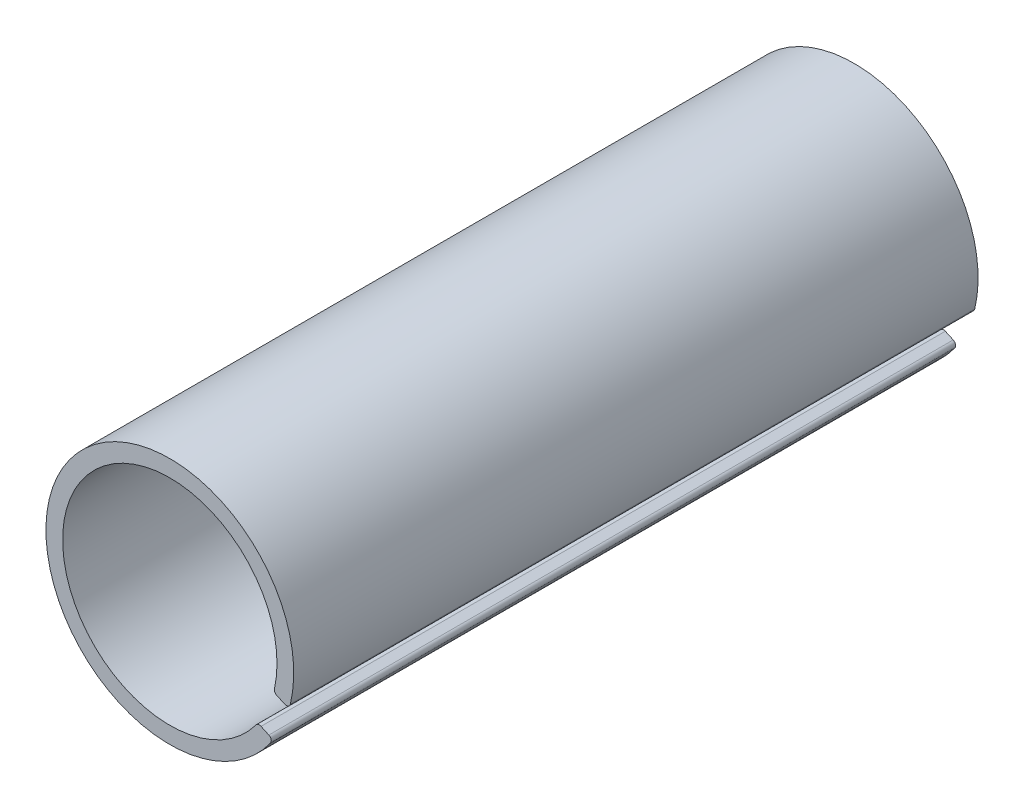
ISO-10303-21;
HEADER;
FILE_DESCRIPTION(('STEP AP214'),'2;1');
FILE_NAME('part.step','',(''),(''),'','','');
FILE_SCHEMA(('AUTOMOTIVE_DESIGN { 1 0 10303 214 1 1 1 1 }'));
ENDSEC;
DATA;
#1=APPLICATION_CONTEXT('core data for automotive mechanical design processes');
#2=APPLICATION_PROTOCOL_DEFINITION('international standard','automotive_design',2000,#1);
#3=PRODUCT_CONTEXT('',#1,'mechanical');
#4=PRODUCT('Part','Part','',(#3));
#5=PRODUCT_RELATED_PRODUCT_CATEGORY('part','',(#4));
#6=PRODUCT_DEFINITION_FORMATION('','',#4);
#7=PRODUCT_DEFINITION_CONTEXT('part definition',#1,'design');
#8=PRODUCT_DEFINITION('design','',#6,#7);
#9=PRODUCT_DEFINITION_SHAPE('','',#8);
#10=(LENGTH_UNIT() NAMED_UNIT(*) SI_UNIT(.MILLI.,.METRE.));
#11=(NAMED_UNIT(*) PLANE_ANGLE_UNIT() SI_UNIT($,.RADIAN.));
#12=(NAMED_UNIT(*) SI_UNIT($,.STERADIAN.) SOLID_ANGLE_UNIT());
#13=UNCERTAINTY_MEASURE_WITH_UNIT(LENGTH_MEASURE(1.E-05),#10,'distance_accuracy_value','');
#14=(GEOMETRIC_REPRESENTATION_CONTEXT(3) GLOBAL_UNCERTAINTY_ASSIGNED_CONTEXT((#13)) GLOBAL_UNIT_ASSIGNED_CONTEXT((#10,
#11,#12)) REPRESENTATION_CONTEXT('',''));
#15=CARTESIAN_POINT('',(0.,0.,0.));
#16=DIRECTION('',(0.,0.,1.));
#17=DIRECTION('',(1.,0.,0.));
#18=AXIS2_PLACEMENT_3D('',#15,#16,#17);
#19=CARTESIAN_POINT('',(11.8023506553898,-8.46744552580763,83.));
#20=DIRECTION('',(0.,0.,-1.));
#21=DIRECTION('',(-1.,0.,0.));
#22=AXIS2_PLACEMENT_3D('',#19,#20,#21);
#23=CYLINDRICAL_SURFACE('',#22,0.500000000000001);
#24=CARTESIAN_POINT('',(11.8023506553898,-8.46744552580763,0.));
#25=DIRECTION('',(0.,0.,1.));
#26=DIRECTION('',(-1.,0.,0.));
#27=AXIS2_PLACEMENT_3D('',#24,#25,#26);
#28=CIRCLE('',#27,0.500000000000001);
#29=CARTESIAN_POINT('',(12.2086109473925,-8.75891177624141,0.));
#30=VERTEX_POINT('',#29);
#31=CARTESIAN_POINT('',(12.0095901442129,-8.01241608250494,0.));
#32=VERTEX_POINT('',#31);
#33=EDGE_CURVE('E129',#30,#32,#28,.T.);
#34=ORIENTED_EDGE('',*,*,#33,.T.);
#35=DIRECTION('',(0.,0.,-1.));
#36=VECTOR('',#35,1.);
#37=CARTESIAN_POINT('',(12.0095901442129,-8.01241608250494,83.));
#38=LINE('',#37,#36);
#39=CARTESIAN_POINT('',(12.0095901442129,-8.01241608250494,83.));
#40=VERTEX_POINT('',#39);
#41=EDGE_CURVE('E11',#40,#32,#38,.T.);
#42=ORIENTED_EDGE('',*,*,#41,.F.);
#43=CARTESIAN_POINT('',(11.8023506553898,-8.46744552580763,83.));
#44=DIRECTION('',(0.,0.,1.));
#45=DIRECTION('',(-1.,0.,0.));
#46=AXIS2_PLACEMENT_3D('',#43,#44,#45);
#47=CIRCLE('',#46,0.500000000000001);
#48=CARTESIAN_POINT('',(12.2086109473925,-8.75891177624141,83.));
#49=VERTEX_POINT('',#48);
#50=EDGE_CURVE('E143',#49,#40,#47,.T.);
#51=ORIENTED_EDGE('',*,*,#50,.F.);
#52=DIRECTION('',(0.,0.,-1.));
#53=VECTOR('',#52,1.);
#54=CARTESIAN_POINT('',(12.2086109473925,-8.75891177624141,83.));
#55=LINE('',#54,#53);
#56=EDGE_CURVE('E125',#49,#30,#55,.T.);
#57=ORIENTED_EDGE('',*,*,#56,.T.);
#58=EDGE_LOOP('',(#34,#42,#51,#57));
#59=FACE_BOUND('',#58,.T.);
#60=ADVANCED_FACE('F33',(#59),#23,.T.);
#61=CARTESIAN_POINT('',(12.0095901442129,-8.01241608250494,83.));
#62=DIRECTION('',(-0.414478977646094,-0.910058886605393,0.));
#63=DIRECTION('',(0.910058886605394,-0.414478977646094,0.));
#64=AXIS2_PLACEMENT_3D('',#61,#62,#63);
#65=PLANE('',#64);
#66=DIRECTION('',(-0.910058886605393,0.414478977646094,0.));
#67=VECTOR('',#66,1.);
#68=CARTESIAN_POINT('',(12.0095901442129,-8.01241608250494,0.));
#69=LINE('',#68,#67);
#70=CARTESIAN_POINT('',(11.0567943159302,-7.57847290956904,0.));
#71=VERTEX_POINT('',#70);
#72=EDGE_CURVE('E132',#32,#71,#69,.T.);
#73=ORIENTED_EDGE('',*,*,#72,.T.);
#74=DIRECTION('',(0.,0.,-1.));
#75=VECTOR('',#74,1.);
#76=CARTESIAN_POINT('',(11.0567943159302,-7.57847290956904,83.));
#77=LINE('',#76,#75);
#78=CARTESIAN_POINT('',(11.0567943159302,-7.57847290956904,83.));
#79=VERTEX_POINT('',#78);
#80=EDGE_CURVE('E41',#79,#71,#77,.T.);
#81=ORIENTED_EDGE('',*,*,#80,.F.);
#82=DIRECTION('',(-0.910058886605393,0.414478977646094,0.));
#83=VECTOR('',#82,1.);
#84=CARTESIAN_POINT('',(12.0095901442129,-8.01241608250494,83.));
#85=LINE('',#84,#83);
#86=EDGE_CURVE('E92',#40,#79,#85,.T.);
#87=ORIENTED_EDGE('',*,*,#86,.F.);
#88=ORIENTED_EDGE('',*,*,#41,.T.);
#89=EDGE_LOOP('',(#73,#81,#87,#88));
#90=FACE_BOUND('',#89,.T.);
#91=ADVANCED_FACE('F178',(#90),#65,.F.);
#92=CARTESIAN_POINT('',(10.8495548271072,-8.03350235287174,83.));
#93=DIRECTION('',(0.,0.,-1.));
#94=DIRECTION('',(-1.,0.,0.));
#95=AXIS2_PLACEMENT_3D('',#92,#93,#94);
#96=CYLINDRICAL_SURFACE('',#95,0.499999999999999);
#97=CARTESIAN_POINT('',(10.8495548271072,-8.03350235287174,0.));
#98=DIRECTION('',(0.,0.,1.));
#99=DIRECTION('',(-1.,0.,0.));
#100=AXIS2_PLACEMENT_3D('',#97,#98,#99);
#101=CIRCLE('',#100,0.499999999999999);
#102=CARTESIAN_POINT('',(10.4477194631402,-7.7359652286913,0.));
#103=VERTEX_POINT('',#102);
#104=EDGE_CURVE('E134',#71,#103,#101,.T.);
#105=ORIENTED_EDGE('',*,*,#104,.T.);
#106=DIRECTION('',(0.,0.,-1.));
#107=VECTOR('',#106,1.);
#108=CARTESIAN_POINT('',(10.4477194631402,-7.7359652286913,83.));
#109=LINE('',#108,#107);
#110=CARTESIAN_POINT('',(10.4477194631402,-7.7359652286913,83.));
#111=VERTEX_POINT('',#110);
#112=EDGE_CURVE('E150',#111,#103,#109,.T.);
#113=ORIENTED_EDGE('',*,*,#112,.F.);
#114=CARTESIAN_POINT('',(10.8495548271072,-8.03350235287174,83.));
#115=DIRECTION('',(0.,0.,1.));
#116=DIRECTION('',(-1.,0.,0.));
#117=AXIS2_PLACEMENT_3D('',#114,#115,#116);
#118=CIRCLE('',#117,0.499999999999999);
#119=EDGE_CURVE('E158',#79,#111,#118,.T.);
#120=ORIENTED_EDGE('',*,*,#119,.F.);
#121=ORIENTED_EDGE('',*,*,#80,.T.);
#122=EDGE_LOOP('',(#105,#113,#120,#121));
#123=FACE_BOUND('',#122,.T.);
#124=ADVANCED_FACE('F156',(#123),#96,.T.);
#125=CARTESIAN_POINT('',(0.,0.,83.));
#126=DIRECTION('',(0.,0.,-1.));
#127=DIRECTION('',(-1.,0.,0.));
#128=AXIS2_PLACEMENT_3D('',#125,#126,#127);
#129=CYLINDRICAL_SURFACE('',#128,13.);
#130=CARTESIAN_POINT('',(0.,0.,0.));
#131=DIRECTION('',(0.,0.,-1.));
#132=DIRECTION('',(1.,0.,0.));
#133=AXIS2_PLACEMENT_3D('',#130,#131,#132);
#134=CIRCLE('',#133,13.);
#135=CARTESIAN_POINT('',(12.6927240734143,-2.80976077205327,0.));
#136=VERTEX_POINT('',#135);
#137=EDGE_CURVE('E136',#103,#136,#134,.T.);
#138=ORIENTED_EDGE('',*,*,#137,.T.);
#139=DIRECTION('',(0.,0.,-1.));
#140=VECTOR('',#139,1.);
#141=CARTESIAN_POINT('',(12.6927240734143,-2.80976077205327,83.));
#142=LINE('',#141,#140);
#143=CARTESIAN_POINT('',(12.6927240734143,-2.80976077205327,83.));
#144=VERTEX_POINT('',#143);
#145=EDGE_CURVE('E147',#144,#136,#142,.T.);
#146=ORIENTED_EDGE('',*,*,#145,.F.);
#147=CARTESIAN_POINT('',(0.,0.,83.));
#148=DIRECTION('',(0.,0.,-1.));
#149=DIRECTION('',(1.,0.,0.));
#150=AXIS2_PLACEMENT_3D('',#147,#148,#149);
#151=CIRCLE('',#150,13.);
#152=EDGE_CURVE('E170',#111,#144,#151,.T.);
#153=ORIENTED_EDGE('',*,*,#152,.F.);
#154=ORIENTED_EDGE('',*,*,#112,.T.);
#155=EDGE_LOOP('',(#138,#146,#153,#154));
#156=FACE_BOUND('',#155,.T.);
#157=ADVANCED_FACE('F166',(#156),#129,.F.);
#158=CARTESIAN_POINT('',(13.1809057685456,-2.91782849405531,83.));
#159=DIRECTION('',(0.,0.,-1.));
#160=DIRECTION('',(-1.,0.,0.));
#161=AXIS2_PLACEMENT_3D('',#158,#159,#160);
#162=CYLINDRICAL_SURFACE('',#161,0.5);
#163=CARTESIAN_POINT('',(13.1809057685456,-2.91782849405531,0.));
#164=DIRECTION('',(0.,0.,1.));
#165=DIRECTION('',(1.,0.,0.));
#166=AXIS2_PLACEMENT_3D('',#163,#164,#165);
#167=CIRCLE('',#166,0.5);
#168=CARTESIAN_POINT('',(12.9736931510126,-3.37287017471228,0.));
#169=VERTEX_POINT('',#168);
#170=EDGE_CURVE('E138',#136,#169,#167,.T.);
#171=ORIENTED_EDGE('',*,*,#170,.T.);
#172=DIRECTION('',(0.,0.,-1.));
#173=VECTOR('',#172,1.);
#174=CARTESIAN_POINT('',(12.9736931510126,-3.37287017471228,83.));
#175=LINE('',#174,#173);
#176=CARTESIAN_POINT('',(12.9736931510126,-3.37287017471228,83.));
#177=VERTEX_POINT('',#176);
#178=EDGE_CURVE('E120',#177,#169,#175,.T.);
#179=ORIENTED_EDGE('',*,*,#178,.F.);
#180=CARTESIAN_POINT('',(13.1809057685456,-2.91782849405531,83.));
#181=DIRECTION('',(0.,0.,1.));
#182=DIRECTION('',(1.,0.,0.));
#183=AXIS2_PLACEMENT_3D('',#180,#181,#182);
#184=CIRCLE('',#183,0.5);
#185=EDGE_CURVE('E111',#144,#177,#184,.T.);
#186=ORIENTED_EDGE('',*,*,#185,.F.);
#187=ORIENTED_EDGE('',*,*,#145,.T.);
#188=EDGE_LOOP('',(#171,#179,#186,#187));
#189=FACE_BOUND('',#188,.T.);
#190=ADVANCED_FACE('F169',(#189),#162,.T.);
#191=CARTESIAN_POINT('',(13.9264147767903,-3.80671162319824,83.));
#192=DIRECTION('',(0.41442523506604,0.910083361313928,0.));
#193=DIRECTION('',(-0.910083361313928,0.41442523506604,0.));
#194=AXIS2_PLACEMENT_3D('',#191,#192,#193);
#195=PLANE('',#194);
#196=DIRECTION('',(0.910083361313928,-0.41442523506604,0.));
#197=VECTOR('',#196,1.);
#198=CARTESIAN_POINT('',(13.9264147767903,-3.80671162319824,0.));
#199=LINE('',#198,#197);
#200=CARTESIAN_POINT('',(13.9264147767903,-3.80671162319824,0.));
#201=VERTEX_POINT('',#200);
#202=EDGE_CURVE('E119',#169,#201,#199,.T.);
#203=ORIENTED_EDGE('',*,*,#202,.T.);
#204=DIRECTION('',(0.,0.,-1.));
#205=VECTOR('',#204,1.);
#206=CARTESIAN_POINT('',(13.9264147767903,-3.80671162319824,83.));
#207=LINE('',#206,#205);
#208=CARTESIAN_POINT('',(13.9264147767903,-3.80671162319824,83.));
#209=VERTEX_POINT('',#208);
#210=EDGE_CURVE('E116',#209,#201,#207,.T.);
#211=ORIENTED_EDGE('',*,*,#210,.F.);
#212=DIRECTION('',(0.910083361313928,-0.41442523506604,0.));
#213=VECTOR('',#212,1.);
#214=CARTESIAN_POINT('',(13.9264147767903,-3.80671162319824,83.));
#215=LINE('',#214,#213);
#216=EDGE_CURVE('E105',#177,#209,#215,.T.);
#217=ORIENTED_EDGE('',*,*,#216,.F.);
#218=ORIENTED_EDGE('',*,*,#178,.T.);
#219=EDGE_LOOP('',(#203,#211,#217,#218));
#220=FACE_BOUND('',#219,.T.);
#221=ADVANCED_FACE('F117',(#220),#195,.F.);
#222=CARTESIAN_POINT('',(14.1336273943233,-3.35166994254127,83.));
#223=DIRECTION('',(0.,0.,-1.));
#224=DIRECTION('',(-1.,0.,0.));
#225=AXIS2_PLACEMENT_3D('',#222,#223,#224);
#226=CYLINDRICAL_SURFACE('',#225,0.500000000000001);
#227=CARTESIAN_POINT('',(14.1336273943233,-3.35166994254127,0.));
#228=DIRECTION('',(0.,0.,1.));
#229=DIRECTION('',(1.,0.,0.));
#230=AXIS2_PLACEMENT_3D('',#227,#228,#229);
#231=CIRCLE('',#230,0.500000000000001);
#232=CARTESIAN_POINT('',(14.6201348503318,-3.46704106218611,0.));
#233=VERTEX_POINT('',#232);
#234=EDGE_CURVE('E78',#201,#233,#231,.T.);
#235=ORIENTED_EDGE('',*,*,#234,.T.);
#236=DIRECTION('',(0.,0.,-1.));
#237=VECTOR('',#236,1.);
#238=CARTESIAN_POINT('',(14.6201348503318,-3.46704106218611,83.));
#239=LINE('',#238,#237);
#240=CARTESIAN_POINT('',(14.6201348503318,-3.46704106218611,83.));
#241=VERTEX_POINT('',#240);
#242=EDGE_CURVE('E121',#241,#233,#239,.T.);
#243=ORIENTED_EDGE('',*,*,#242,.F.);
#244=CARTESIAN_POINT('',(14.1336273943233,-3.35166994254127,83.));
#245=DIRECTION('',(0.,0.,1.));
#246=DIRECTION('',(1.,0.,0.));
#247=AXIS2_PLACEMENT_3D('',#244,#245,#246);
#248=CIRCLE('',#247,0.500000000000001);
#249=EDGE_CURVE('E109',#209,#241,#248,.T.);
#250=ORIENTED_EDGE('',*,*,#249,.F.);
#251=ORIENTED_EDGE('',*,*,#210,.T.);
#252=EDGE_LOOP('',(#235,#243,#250,#251));
#253=FACE_BOUND('',#252,.T.);
#254=ADVANCED_FACE('F123',(#253),#226,.T.);
#255=CARTESIAN_POINT('',(0.,0.,83.));
#256=DIRECTION('',(0.,0.,-1.));
#257=DIRECTION('',(-1.,0.,0.));
#258=AXIS2_PLACEMENT_3D('',#255,#256,#257);
#259=CYLINDRICAL_SURFACE('',#258,15.0256020434714);
#260=CARTESIAN_POINT('',(0.,0.,0.));
#261=DIRECTION('',(0.,0.,1.));
#262=DIRECTION('',(-1.,0.,0.));
#263=AXIS2_PLACEMENT_3D('',#260,#261,#262);
#264=CIRCLE('',#263,15.0256020434714);
#265=EDGE_CURVE('E84',#233,#30,#264,.T.);
#266=ORIENTED_EDGE('',*,*,#265,.T.);
#267=ORIENTED_EDGE('',*,*,#56,.F.);
#268=CARTESIAN_POINT('',(0.,0.,83.));
#269=DIRECTION('',(0.,0.,1.));
#270=DIRECTION('',(-1.,0.,0.));
#271=AXIS2_PLACEMENT_3D('',#268,#269,#270);
#272=CIRCLE('',#271,15.0256020434714);
#273=EDGE_CURVE('E49',#241,#49,#272,.T.);
#274=ORIENTED_EDGE('',*,*,#273,.F.);
#275=ORIENTED_EDGE('',*,*,#242,.T.);
#276=EDGE_LOOP('',(#266,#267,#274,#275));
#277=FACE_BOUND('',#276,.T.);
#278=ADVANCED_FACE('F194',(#277),#259,.T.);
#279=CARTESIAN_POINT('',(11.8023506553898,-8.46744552580763,83.));
#280=DIRECTION('',(0.,0.,-1.));
#281=DIRECTION('',(-1.,0.,0.));
#282=AXIS2_PLACEMENT_3D('',#279,#280,#281);
#283=PLANE('',#282);
#284=ORIENTED_EDGE('',*,*,#50,.T.);
#285=ORIENTED_EDGE('',*,*,#86,.T.);
#286=ORIENTED_EDGE('',*,*,#119,.T.);
#287=ORIENTED_EDGE('',*,*,#152,.T.);
#288=ORIENTED_EDGE('',*,*,#185,.T.);
#289=ORIENTED_EDGE('',*,*,#216,.T.);
#290=ORIENTED_EDGE('',*,*,#249,.T.);
#291=ORIENTED_EDGE('',*,*,#273,.T.);
#292=EDGE_LOOP('',(#284,#285,#286,#287,#288,#289,#290,#291));
#293=FACE_BOUND('',#292,.T.);
#294=ADVANCED_FACE('F107',(#293),#283,.F.);
#295=CARTESIAN_POINT('',(11.8023506553898,-8.46744552580763,0.));
#296=DIRECTION('',(0.,0.,-1.));
#297=DIRECTION('',(-1.,0.,0.));
#298=AXIS2_PLACEMENT_3D('',#295,#296,#297);
#299=PLANE('',#298);
#300=ORIENTED_EDGE('',*,*,#33,.F.);
#301=ORIENTED_EDGE('',*,*,#265,.F.);
#302=ORIENTED_EDGE('',*,*,#234,.F.);
#303=ORIENTED_EDGE('',*,*,#202,.F.);
#304=ORIENTED_EDGE('',*,*,#170,.F.);
#305=ORIENTED_EDGE('',*,*,#137,.F.);
#306=ORIENTED_EDGE('',*,*,#104,.F.);
#307=ORIENTED_EDGE('',*,*,#72,.F.);
#308=EDGE_LOOP('',(#300,#301,#302,#303,#304,#305,#306,#307));
#309=FACE_BOUND('',#308,.T.);
#310=ADVANCED_FACE('F162',(#309),#299,.T.);
#311=CLOSED_SHELL('',(#60,#91,#124,#157,#190,#221,#254,#278,#294,#310));
#312=MANIFOLD_SOLID_BREP('B2',#311);
#313=ADVANCED_BREP_SHAPE_REPRESENTATION('',(#18,#312),#14);
#314=SHAPE_DEFINITION_REPRESENTATION(#9,#313);
ENDSEC;
END-ISO-10303-21;
